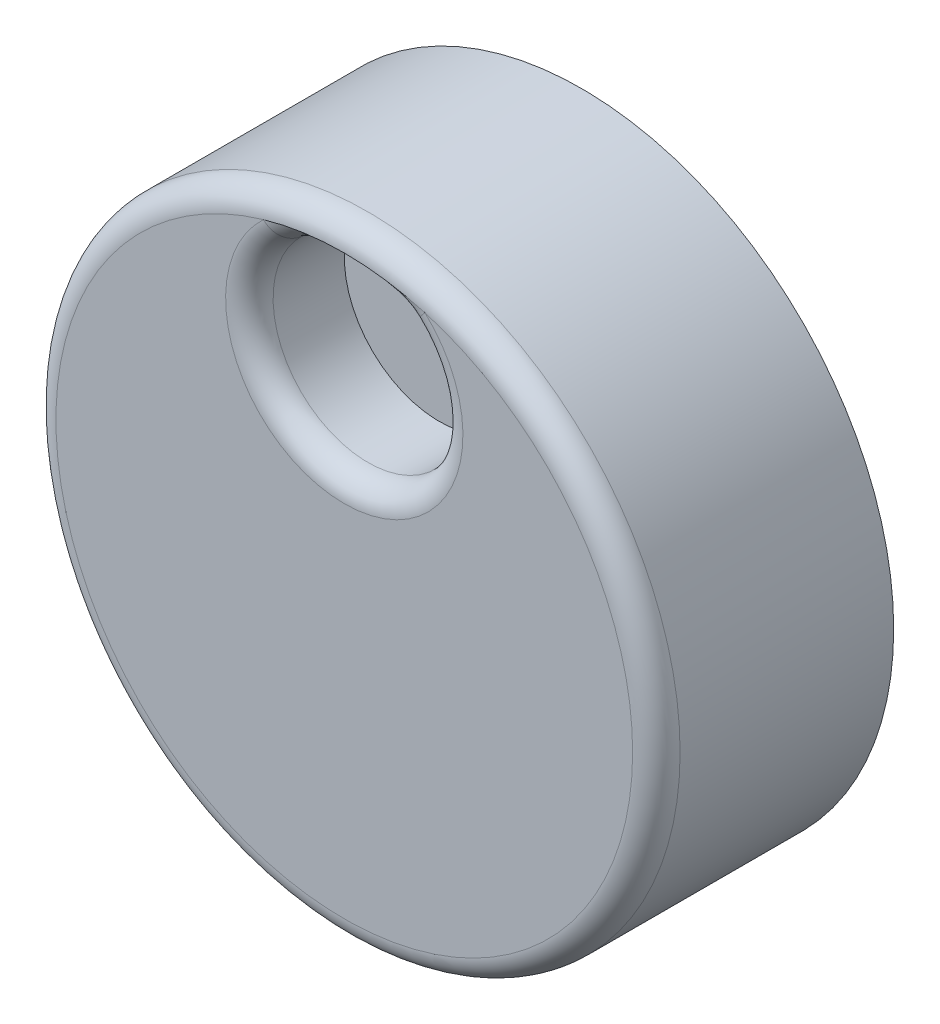
ISO-10303-21;
HEADER;
FILE_DESCRIPTION(('STEP AP214'),'2;1');
FILE_NAME('part.step','',(''),(''),'','','');
FILE_SCHEMA(('AUTOMOTIVE_DESIGN { 1 0 10303 214 1 1 1 1 }'));
ENDSEC;
DATA;
#1=APPLICATION_CONTEXT('core data for automotive mechanical design processes');
#2=APPLICATION_PROTOCOL_DEFINITION('international standard','automotive_design',2000,#1);
#3=PRODUCT_CONTEXT('',#1,'mechanical');
#4=PRODUCT('Part','Part','',(#3));
#5=PRODUCT_RELATED_PRODUCT_CATEGORY('part','',(#4));
#6=PRODUCT_DEFINITION_FORMATION('','',#4);
#7=PRODUCT_DEFINITION_CONTEXT('part definition',#1,'design');
#8=PRODUCT_DEFINITION('design','',#6,#7);
#9=PRODUCT_DEFINITION_SHAPE('','',#8);
#10=(LENGTH_UNIT() NAMED_UNIT(*) SI_UNIT(.MILLI.,.METRE.));
#11=(NAMED_UNIT(*) PLANE_ANGLE_UNIT() SI_UNIT($,.RADIAN.));
#12=(NAMED_UNIT(*) SI_UNIT($,.STERADIAN.) SOLID_ANGLE_UNIT());
#13=UNCERTAINTY_MEASURE_WITH_UNIT(LENGTH_MEASURE(1.E-05),#10,'distance_accuracy_value','');
#14=(GEOMETRIC_REPRESENTATION_CONTEXT(3) GLOBAL_UNCERTAINTY_ASSIGNED_CONTEXT((#13)) GLOBAL_UNIT_ASSIGNED_CONTEXT((#10,
#11,#12)) REPRESENTATION_CONTEXT('',''));
#15=CARTESIAN_POINT('',(0.,0.,0.));
#16=DIRECTION('',(0.,0.,1.));
#17=DIRECTION('',(1.,0.,0.));
#18=AXIS2_PLACEMENT_3D('',#15,#16,#17);
#19=CARTESIAN_POINT('',(0.,0.,10.));
#20=DIRECTION('',(0.,0.,-1.));
#21=DIRECTION('',(-1.,0.,0.));
#22=AXIS2_PLACEMENT_3D('',#19,#20,#21);
#23=CYLINDRICAL_SURFACE('',#22,13.15);
#24=CARTESIAN_POINT('',(0.,0.,9.));
#25=DIRECTION('',(0.,0.,1.));
#26=DIRECTION('',(1.,0.,0.));
#27=AXIS2_PLACEMENT_3D('',#24,#25,#26);
#28=CIRCLE('',#27,13.15);
#29=CARTESIAN_POINT('',(13.15,0.,9.));
#30=VERTEX_POINT('',#29);
#31=EDGE_CURVE('E88',#30,#30,#28,.F.);
#32=ORIENTED_EDGE('',*,*,#31,.T.);
#33=EDGE_LOOP('',(#32));
#34=FACE_BOUND('',#33,.T.);
#35=CARTESIAN_POINT('',(0.,0.,0.));
#36=DIRECTION('',(0.,0.,1.));
#37=DIRECTION('',(1.,0.,0.));
#38=AXIS2_PLACEMENT_3D('',#35,#36,#37);
#39=CIRCLE('',#38,13.15);
#40=CARTESIAN_POINT('',(13.15,0.,0.));
#41=VERTEX_POINT('',#40);
#42=EDGE_CURVE('E122',#41,#41,#39,.T.);
#43=ORIENTED_EDGE('',*,*,#42,.T.);
#44=EDGE_LOOP('',(#43));
#45=FACE_BOUND('',#44,.T.);
#46=ADVANCED_FACE('F43',(#34,#45),#23,.T.);
#47=CARTESIAN_POINT('',(0.,0.,10.));
#48=DIRECTION('',(0.,0.,1.));
#49=DIRECTION('',(1.,0.,0.));
#50=AXIS2_PLACEMENT_3D('',#47,#48,#49);
#51=PLANE('',#50);
#52=CARTESIAN_POINT('',(0.,0.,10.));
#53=DIRECTION('',(0.,0.,1.));
#54=DIRECTION('',(1.,0.,0.));
#55=AXIS2_PLACEMENT_3D('',#52,#53,#54);
#56=CIRCLE('',#55,12.15);
#57=CARTESIAN_POINT('',(-3.40232141209659,11.66390625,10.));
#58=VERTEX_POINT('',#57);
#59=CARTESIAN_POINT('',(3.40232141209659,11.66390625,10.));
#60=VERTEX_POINT('',#59);
#61=EDGE_CURVE('E127',#58,#60,#56,.T.);
#62=ORIENTED_EDGE('',*,*,#61,.T.);
#63=CARTESIAN_POINT('',(0.,8.,10.));
#64=DIRECTION('',(0.,0.,1.));
#65=DIRECTION('',(1.,0.,0.));
#66=AXIS2_PLACEMENT_3D('',#63,#64,#65);
#67=CIRCLE('',#66,5.);
#68=EDGE_CURVE('E11',#60,#58,#67,.F.);
#69=ORIENTED_EDGE('',*,*,#68,.T.);
#70=EDGE_LOOP('',(#62,#69));
#71=FACE_BOUND('',#70,.T.);
#72=ADVANCED_FACE('F115',(#71),#51,.T.);
#73=CARTESIAN_POINT('',(0.,0.,0.));
#74=DIRECTION('',(0.,0.,1.));
#75=DIRECTION('',(1.,0.,0.));
#76=AXIS2_PLACEMENT_3D('',#73,#74,#75);
#77=PLANE('',#76);
#78=CARTESIAN_POINT('',(0.,0.,0.));
#79=DIRECTION('',(0.,0.,-1.));
#80=DIRECTION('',(-1.,0.,0.));
#81=AXIS2_PLACEMENT_3D('',#78,#79,#80);
#82=CIRCLE('',#81,3.125);
#83=CARTESIAN_POINT('',(-3.125,0.,0.));
#84=VERTEX_POINT('',#83);
#85=EDGE_CURVE('E130',#84,#84,#82,.T.);
#86=ORIENTED_EDGE('',*,*,#85,.F.);
#87=EDGE_LOOP('',(#86));
#88=FACE_BOUND('',#87,.T.);
#89=ORIENTED_EDGE('',*,*,#42,.F.);
#90=EDGE_LOOP('',(#89));
#91=FACE_BOUND('',#90,.T.);
#92=ADVANCED_FACE('F140',(#88,#91),#77,.F.);
#93=CARTESIAN_POINT('',(0.,0.,9.));
#94=DIRECTION('',(0.,0.,1.));
#95=DIRECTION('',(1.,0.,0.));
#96=AXIS2_PLACEMENT_3D('',#93,#94,#95);
#97=TOROIDAL_SURFACE('',#96,12.15,1.);
#98=ORIENTED_EDGE('',*,*,#31,.F.);
#99=EDGE_LOOP('',(#98));
#100=FACE_BOUND('',#99,.T.);
#101=EDGE_CURVE('E82',#60,#58,#56,.T.);
#102=ORIENTED_EDGE('',*,*,#101,.F.);
#103=ORIENTED_EDGE('',*,*,#61,.F.);
#104=EDGE_LOOP('',(#102,#103));
#105=FACE_BOUND('',#104,.T.);
#106=ADVANCED_FACE('F106',(#100,#105),#97,.T.);
#107=CARTESIAN_POINT('',(0.,8.,6.));
#108=DIRECTION('',(0.,0.,1.));
#109=DIRECTION('',(1.,0.,0.));
#110=AXIS2_PLACEMENT_3D('',#107,#108,#109);
#111=CYLINDRICAL_SURFACE('',#110,4.);
#112=CARTESIAN_POINT('',(0.,8.,9.));
#113=DIRECTION('',(0.,0.,1.));
#114=DIRECTION('',(1.,0.,0.));
#115=AXIS2_PLACEMENT_3D('',#112,#113,#114);
#116=CIRCLE('',#115,4.);
#117=CARTESIAN_POINT('',(-2.72185712967727,10.931125,9.));
#118=VERTEX_POINT('',#117);
#119=CARTESIAN_POINT('',(2.72185712967727,10.931125,9.));
#120=VERTEX_POINT('',#119);
#121=EDGE_CURVE('E86',#118,#120,#116,.T.);
#122=ORIENTED_EDGE('',*,*,#121,.T.);
#123=CARTESIAN_POINT('',(4.15330833535075,11.4180790797536,10.));
#124=CARTESIAN_POINT('',(3.72763776066255,11.1642189126805,10.1914181977703));
#125=CARTESIAN_POINT('',(3.42224825637452,10.8375690498555,9.90450624819956));
#126=CARTESIAN_POINT('',(3.11685875208649,10.5109191870305,9.61759429862879));
#127=CARTESIAN_POINT('',(3.20066403612086,10.3991143632354,9.10499532792805));
#128=CARTESIAN_POINT('',(4.09555974182805,11.4390907582192,10.));
#129=CARTESIAN_POINT('',(3.68294707085545,11.1722052705689,10.1738068568766));
#130=CARTESIAN_POINT('',(3.38763479748877,10.8562041720172,9.88313811042775));
#131=CARTESIAN_POINT('',(3.09263331720612,10.5400121915394,9.5926535912695));
#132=CARTESIAN_POINT('',(3.16674630733149,10.4443878403858,9.08576928020311));
#133=CARTESIAN_POINT('',(4.03677559062463,11.4599718929904,10.));
#134=CARTESIAN_POINT('',(3.63675862072685,11.1830507222994,10.1562165783765));
#135=CARTESIAN_POINT('',(3.35129275605686,10.8772723075058,9.86292421447825));
#136=CARTESIAN_POINT('',(3.06613320245137,10.5713032889187,9.56978342834648));
#137=CARTESIAN_POINT('',(3.13146918846418,10.4894277666376,9.06975703229647));
#138=CARTESIAN_POINT('',(3.91771517635129,11.5012144177846,10.));
#139=CARTESIAN_POINT('',(3.54230224911096,11.2089801170612,10.1219968336009));
#140=CARTESIAN_POINT('',(3.27566060010154,10.9228548985107,9.82511715135767));
#141=CARTESIAN_POINT('',(3.00931471034941,10.6365573637621,9.52838683945949));
#142=CARTESIAN_POINT('',(3.05854702412956,10.5784810157243,9.043268773883));
#143=CARTESIAN_POINT('',(3.85744214272831,11.5215767663186,10.));
#144=CARTESIAN_POINT('',(3.49403032688505,11.2240289565234,10.1053489981445));
#145=CARTESIAN_POINT('',(3.23637654515488,10.9473623565001,9.80751880875616));
#146=CARTESIAN_POINT('',(2.97901926808651,10.6705109119552,9.50980678939183));
#147=CARTESIAN_POINT('',(3.02090687027421,10.6224962165467,9.03278172300138));
#148=CARTESIAN_POINT('',(3.73618837091529,11.5614641006066,10.));
#149=CARTESIAN_POINT('',(3.39606975585306,11.2568820807277,10.0737646411657));
#150=CARTESIAN_POINT('',(3.15552102529219,10.9983044893818,9.77528436126342));
#151=CARTESIAN_POINT('',(2.9152646666267,10.739540755735,9.47692067660312));
#152=CARTESIAN_POINT('',(2.94375164926536,10.7088121378773,9.01644213860568));
#153=CARTESIAN_POINT('',(3.67521592173952,11.5809940835346,10.));
#154=CARTESIAN_POINT('',(3.34638267309756,11.2746531282782,10.0587975224619));
#155=CARTESIAN_POINT('',(3.1139681909994,11.0247239181331,9.76062772218791));
#156=CARTESIAN_POINT('',(2.88183868443764,10.7746141628773,9.46254700494208));
#157=CARTESIAN_POINT('',(2.90425213847084,10.7511229680481,9.01055658425827));
#158=CARTESIAN_POINT('',(3.55236902775948,11.6192648762249,10.));
#159=CARTESIAN_POINT('',(3.24546849327123,11.3120620178251,10.030628327074));
#160=CARTESIAN_POINT('',(3.02858616222957,11.0787386803592,9.73403742586988));
#161=CARTESIAN_POINT('',(2.81198722098302,10.8452363246162,9.43753444811353));
#162=CARTESIAN_POINT('',(2.82331132896572,10.8341269572392,9.00260420748856));
#163=CARTESIAN_POINT('',(3.4904939855267,11.6380051280857,10.));
#164=CARTESIAN_POINT('',(3.19422419593948,11.3316985546186,10.0174084390009));
#165=CARTESIAN_POINT('',(2.98475540577288,11.1063348183164,9.72210566815499));
#166=CARTESIAN_POINT('',(2.7755612946147,10.8808006869627,9.4268668997257));
#167=CARTESIAN_POINT('',(2.78186869980844,10.8748189715558,9.00054004189399));
#168=CARTESIAN_POINT('',(3.33121735656144,11.6848499041843,10.));
#169=CARTESIAN_POINT('',(3.06153488861087,11.3832611459852,9.98598150696315));
#170=CARTESIAN_POINT('',(2.86995618167547,11.1775299819973,9.69487076231434));
#171=CARTESIAN_POINT('',(2.67903916983154,10.9713885266703,9.4039187969668));
#172=CARTESIAN_POINT('',(2.67352963115148,10.9766493927253,8.99939468952385));
#173=CARTESIAN_POINT('',(3.23332607697612,11.712321079107,10.));
#174=CARTESIAN_POINT('',(2.97884276986842,11.416058388639,9.96899131377636));
#175=CARTESIAN_POINT('',(2.7975366742342,11.2214359645996,9.68142177761794));
#176=CARTESIAN_POINT('',(2.61684781414028,11.0264540788388,9.39394327242348));
#177=CARTESIAN_POINT('',(2.60537618560475,11.0364759015107,9.00263147488296));
#178=CARTESIAN_POINT('',(3.03641944287902,11.7649081255496,10.));
#179=CARTESIAN_POINT('',(2.81071480170222,11.4821315676039,9.93931490044425));
#180=CARTESIAN_POINT('',(2.64852244714831,11.308320856117,9.66002501495147));
#181=CARTESIAN_POINT('',(2.48694509841976,11.134151133663,9.3808210535605));
#182=CARTESIAN_POINT('',(2.46540238982909,11.1511896233905,9.01518637199615));
#183=CARTESIAN_POINT('',(2.93740377227428,11.7900233153999,10.));
#184=CARTESIAN_POINT('',(2.72521062932748,11.5154391028625,9.9265786986378));
#185=CARTESIAN_POINT('',(2.57192652919528,11.3512994939661,9.65207882491548));
#186=CARTESIAN_POINT('',(2.41920787702629,11.1868595980264,9.37761324808793));
#187=CARTESIAN_POINT('',(2.39358098755736,11.2060754067745,9.02450623763069));
#188=CARTESIAN_POINT('',(2.63824497803695,11.8618838579157,10.));
#189=CARTESIAN_POINT('',(2.46526268756636,11.6137420914495,9.89418334376081));
#190=CARTESIAN_POINT('',(2.33603030393895,11.4771664601576,9.63513287256471));
#191=CARTESIAN_POINT('',(2.20904187983528,11.3393907037573,9.37625615697228));
#192=CARTESIAN_POINT('',(2.17267529607281,11.3633627373659,9.05950335442168));
#193=CARTESIAN_POINT('',(2.43672202176824,11.9049283867028,10.));
#194=CARTESIAN_POINT('',(2.28572346111084,11.6777969609867,9.88002093306708));
#195=CARTESIAN_POINT('',(2.17115419909485,11.5566382560622,9.63313740537818));
#196=CARTESIAN_POINT('',(2.05839001346352,11.4347267970235,9.38621901592364));
#197=CARTESIAN_POINT('',(2.01865113796147,11.4579245149756,9.09220049345254));
#198=CARTESIAN_POINT('',(2.02251918094506,11.982416714106,10.));
#199=CARTESIAN_POINT('',(1.91123172170543,11.7968965185356,9.86255787860872));
#200=CARTESIAN_POINT('',(1.82278554432249,11.7031714855675,9.6412975099736));
#201=CARTESIAN_POINT('',(1.736287491882,11.6086203010349,9.41998385167425));
#202=CARTESIAN_POINT('',(1.69371984006115,11.6285674318232,9.16861272454309));
#203=CARTESIAN_POINT('',(1.80973316687223,12.0164091038328,10.));
#204=CARTESIAN_POINT('',(1.7152792531206,11.8518066967573,9.85958729123604));
#205=CARTESIAN_POINT('',(1.63879663082088,11.769549219839,9.65198125638214));
#206=CARTESIAN_POINT('',(1.5637314549189,11.6868634644088,9.44428093573634));
#207=CARTESIAN_POINT('',(1.52237093933554,11.7036747580541,9.21274245610353));
#208=CARTESIAN_POINT('',(1.4884677357265,12.0589638991937,10.));
#209=CARTESIAN_POINT('',(1.4156670182159,11.9218583414869,9.86023542553465));
#210=CARTESIAN_POINT('',(1.3556165549775,11.8538023017546,9.6721335738965));
#211=CARTESIAN_POINT('',(1.29591810791628,11.7856447863087,9.48400339720087));
#212=CARTESIAN_POINT('',(1.25892306890879,11.7978671703341,9.2788738434496));
#213=CARTESIAN_POINT('',(1.38103831822383,12.0717426630732,10.));
#214=CARTESIAN_POINT('',(1.31502679989862,11.9431423830585,9.86129155447894));
#215=CARTESIAN_POINT('',(1.26002995817669,11.8793332894086,9.67953820302346));
#216=CARTESIAN_POINT('',(1.20531716800337,11.8154570251107,9.49776173159225));
#217=CARTESIAN_POINT('',(1.17004212741147,11.8261853493842,9.30090572616643));
#218=CARTESIAN_POINT('',(1.16532151859211,12.0944744919206,10.));
#219=CARTESIAN_POINT('',(1.11203102522859,11.9812902839816,9.86439108114283));
#220=CARTESIAN_POINT('',(1.06665658070485,11.9250110296739,9.69467333605554));
#221=CARTESIAN_POINT('',(1.02156659353458,11.868664655329,9.52493421175374));
#222=CARTESIAN_POINT('',(0.990307051406058,11.8765993046376,9.34334895028892));
#223=CARTESIAN_POINT('',(1.05703412146462,12.1044275073788,10.));
#224=CARTESIAN_POINT('',(1.00960283352625,11.9981816153261,9.86643278688582));
#225=CARTESIAN_POINT('',(0.968869761516253,11.9451576879464,9.70240384566767));
#226=CARTESIAN_POINT('',(0.928354112655206,11.8920990974915,9.53835975262656));
#227=CARTESIAN_POINT('',(0.899452882355177,11.8986949718165,9.36376026329617));
#228=CARTESIAN_POINT('',(0.746777598186706,12.128706237492,10.));
#229=CARTESIAN_POINT('',(0.715423387819758,12.039518838517,9.87254830845711));
#230=CARTESIAN_POINT('',(0.687146082683373,11.9944765763669,9.72315946195339));
#231=CARTESIAN_POINT('',(0.659597684360936,11.9493004434,9.5737153165144));
#232=CARTESIAN_POINT('',(0.637780795561235,11.9526219246802,9.41681331009379));
#233=CARTESIAN_POINT('',(0.543370201691124,12.1395641401813,10.));
#234=CARTESIAN_POINT('',(0.520848629561865,12.0583626703459,9.87689118249065));
#235=CARTESIAN_POINT('',(0.500591522282194,12.0167775429719,9.73510371478701));
#236=CARTESIAN_POINT('',(0.480600608420021,11.9751696981066,9.59330669387358));
#237=CARTESIAN_POINT('',(0.464597561784191,11.9767786652202,9.44511527261971));
#238=CARTESIAN_POINT('',(0.236957794965427,12.1481186696398,10.));
#239=CARTESIAN_POINT('',(0.227276853524922,12.073195970524,9.88048613174798));
#240=CARTESIAN_POINT('',(0.218536646319516,12.034359949719,9.74482758170695));
#241=CARTESIAN_POINT('',(0.20986530161471,11.9955226878233,9.60916684507399));
#242=CARTESIAN_POINT('',(0.202811386312069,11.9958131289741,9.46798304312254));
#243=CARTESIAN_POINT('',(0.134722474874996,12.1496841000286,10.));
#244=CARTESIAN_POINT('',(0.129207905164936,12.0759142443947,9.88120053234104));
#245=CARTESIAN_POINT('',(0.124258207345541,12.0375813222467,9.74670599616263));
#246=CARTESIAN_POINT('',(0.119315267894152,11.9992491567235,9.6122115228446));
#247=CARTESIAN_POINT('',(0.115316495548935,11.9992970495361,9.47234766568704));
#248=CARTESIAN_POINT('',(-0.0698277439963968,12.1502292470355,10.));
#249=CARTESIAN_POINT('',(-0.0669641679475987,12.0768584913566,9.88144207294846));
#250=CARTESIAN_POINT('',(-0.0644035655850577,12.0387019556302,9.74734841136457));
#251=CARTESIAN_POINT('',(-0.0618368228265257,12.0005445867432,9.61325464300735));
#252=CARTESIAN_POINT('',(-0.0597690592943022,12.0005101033301,9.47384763292325));
#253=CARTESIAN_POINT('',(-0.172142639927268,12.1492090523496,10.));
#254=CARTESIAN_POINT('',(-0.165130824820578,12.0750852315341,9.88096941309939));
#255=CARTESIAN_POINT('',(-0.158786895832529,12.0366013990466,9.74611251894244));
#256=CARTESIAN_POINT('',(-0.152497545487189,11.9981145996714,9.61125394138614));
#257=CARTESIAN_POINT('',(-0.147359719986136,11.9982394339648,9.47098322557595));
#258=CARTESIAN_POINT('',(-0.37595861720737,12.1446087837909,10.));
#259=CARTESIAN_POINT('',(-0.360428678957753,12.0671118913068,9.87899922155546));
#260=CARTESIAN_POINT('',(-0.346531155340635,12.0271449391545,9.74081588924649));
#261=CARTESIAN_POINT('',(-0.332687415675044,11.9871754952432,9.60263118285602));
#262=CARTESIAN_POINT('',(-0.32160591575245,11.9880031909241,9.45856072822536));
#263=CARTESIAN_POINT('',(-0.477461237277275,12.1410366431067,10.));
#264=CARTESIAN_POINT('',(-0.457624533940897,12.0609204194234,9.87750364337786));
#265=CARTESIAN_POINT('',(-0.43989434493278,12.0198053224766,9.73676390735737));
#266=CARTESIAN_POINT('',(-0.422276662607184,11.9786782028037,9.59601801775486));
#267=CARTESIAN_POINT('',(-0.408263506097927,11.980055266041,9.44902338415118));
#268=CARTESIAN_POINT('',(-0.679697931394177,12.1313959227216,10.));
#269=CARTESIAN_POINT('',(-0.650824252651346,12.0442957210638,9.87397178468277));
#270=CARTESIAN_POINT('',(-0.625350244328963,12.0000590769466,9.72668174187421));
#271=CARTESIAN_POINT('',(-0.599989170528004,11.9558104519794,9.57938559677011));
#272=CARTESIAN_POINT('',(-0.580427786661493,11.9586152480206,9.42478111513024));
#273=CARTESIAN_POINT('',(-0.780431736067347,12.125326505565,10.));
#274=CARTESIAN_POINT('',(-0.746887623495252,12.0338506237216,9.87193354230773));
#275=CARTESIAN_POINT('',(-0.717442517216359,11.9876507483241,9.72065089481));
#276=CARTESIAN_POINT('',(-0.688166594232879,11.9414236050382,9.56935576604321));
#277=CARTESIAN_POINT('',(-0.665934080851751,11.9451212950377,9.41007445690765));
#278=CARTESIAN_POINT('',(-0.981452426330389,12.1107161654073,10.));
#279=CARTESIAN_POINT('',(-0.937938927610036,12.0088801903798,9.86790881769579));
#280=CARTESIAN_POINT('',(-0.900369722197967,11.9579136387431,9.70759797336888));
#281=CARTESIAN_POINT('',(-0.862971220060266,11.9069191007945,9.54727535982534));
#282=CARTESIAN_POINT('',(-0.835821733983299,11.9126601719159,9.37719175014115));
#283=CARTESIAN_POINT('',(-1.08173591083948,12.1021654502764,10.));
#284=CARTESIAN_POINT('',(-1.03297881180094,11.994323217836,9.86592141238133));
#285=CARTESIAN_POINT('',(-0.991198148804839,11.9405653681073,9.70057202932425));
#286=CARTESIAN_POINT('',(-0.949642622018269,11.8867571820935,9.53520615302684));
#287=CARTESIAN_POINT('',(-0.920197222680852,11.8936713176878,9.35900205489224));
#288=CARTESIAN_POINT('',(-1.28148085681784,12.0826481009671,10.));
#289=CARTESIAN_POINT('',(-1.22144336606124,11.9614106603623,9.86260388115434));
#290=CARTESIAN_POINT('',(-1.1709783292179,11.9012128665329,9.68651681261412));
#291=CARTESIAN_POINT('',(-1.12073994388522,11.8409665187416,9.51041091379817));
#292=CARTESIAN_POINT('',(-1.08726141360351,11.8503657317499,9.32079649037561));
#293=CARTESIAN_POINT('',(-1.38094234859781,12.0716815562878,10.));
#294=CARTESIAN_POINT('',(-1.31492531074201,11.9430349429712,9.86127430815106));
#295=CARTESIAN_POINT('',(-1.25993015241272,11.879208808078,9.67948754008155));
#296=CARTESIAN_POINT('',(-1.20521592633857,11.8153093126262,9.49767518795306));
#297=CARTESIAN_POINT('',(-1.16995017819258,11.8260491974144,9.3007806887756));
#298=CARTESIAN_POINT('',(-1.70923206704563,12.031387239508,10.));
#299=CARTESIAN_POINT('',(-1.62243274364111,11.8761158731791,9.85891105452092));
#300=CARTESIAN_POINT('',(-1.55119252872845,11.7989500943254,9.65765363442772));
#301=CARTESIAN_POINT('',(-1.4814506390405,11.7213620354058,9.45629440311797));
#302=CARTESIAN_POINT('',(-1.44082132729463,11.7367929436747,9.23373683030358));
#303=CARTESIAN_POINT('',(-1.93682175166786,11.9968277725055,10.));
#304=CARTESIAN_POINT('',(-1.83294914401225,11.8196834814233,9.86059189152718));
#305=CARTESIAN_POINT('',(-1.74933172474054,11.7309720890454,9.64472808666022));
#306=CARTESIAN_POINT('',(-1.66785435557021,11.6413793824562,9.42880761744408));
#307=CARTESIAN_POINT('',(-1.62527859945721,11.6603705204024,9.18567631239481));
#308=CARTESIAN_POINT('',(-2.27553618678024,11.9355603652723,10.));
#309=CARTESIAN_POINT('',(-2.13954212154813,11.724917206258,9.87270440945455));
#310=CARTESIAN_POINT('',(-2.03599253189325,11.6144037166021,9.63579786731406));
#311=CARTESIAN_POINT('',(-1.93298490945667,11.503675426229,9.39886939793177));
#312=CARTESIAN_POINT('',(-1.89256164180704,11.5253621314983,9.12155713507046));
#313=CARTESIAN_POINT('',(-2.38798821282956,11.9135683958493,10.));
#314=CARTESIAN_POINT('',(-2.24076720166014,11.6914352876043,9.87838899817598));
#315=CARTESIAN_POINT('',(-2.12978194654794,11.5731174292072,9.63456386531438));
#316=CARTESIAN_POINT('',(-2.01941412651827,11.4545104340748,9.39074520885192));
#317=CARTESIAN_POINT('',(-1.98008305331179,11.4769676392503,9.10151379885462));
#318=CARTESIAN_POINT('',(-2.61200603919596,11.8664664543617,10.));
#319=CARTESIAN_POINT('',(-2.44034811392248,11.6219741932335,9.89371230978105));
#320=CARTESIAN_POINT('',(-2.31342398446142,11.4865466196339,9.63667762671307));
#321=CARTESIAN_POINT('',(-2.18712109368884,11.3508242464321,9.37965072869775));
#322=CARTESIAN_POINT('',(-2.15162849142516,11.3735038561697,9.0655329576711));
#323=CARTESIAN_POINT('',(-2.72357214594165,11.8413576152632,10.));
#324=CARTESIAN_POINT('',(-2.53879639125509,11.5859403816062,9.90338495214724));
#325=CARTESIAN_POINT('',(-2.4032780222359,11.441263551984,9.64002372967571));
#326=CARTESIAN_POINT('',(-2.26845891697664,11.2962110311844,9.37670738900951));
#327=CARTESIAN_POINT('',(-2.23565377411598,11.3184369908831,9.04959396723428));
#328=CARTESIAN_POINT('',(-2.98826512484477,11.7778462830621,10.));
#329=CARTESIAN_POINT('',(-2.77001939666946,11.4984858060168,9.93211174914367));
#330=CARTESIAN_POINT('',(-2.61208012289665,11.3299038534849,9.65488254264765));
#331=CARTESIAN_POINT('',(-2.4554822391629,11.1606103481515,9.37775560346197));
#332=CARTESIAN_POINT('',(-2.43117730429263,11.1794200735662,9.01845826777471));
#333=CARTESIAN_POINT('',(-3.1409582835768,11.7380336131283,10.));
#334=CARTESIAN_POINT('',(-2.9012388425958,11.4465125316915,9.95340095971393));
#335=CARTESIAN_POINT('',(-2.72900330223042,11.2625013753159,9.66903043347451));
#336=CARTESIAN_POINT('',(-2.55828813397741,11.0775720154722,9.38495732381403));
#337=CARTESIAN_POINT('',(-2.54088390711084,11.0924812153376,9.00587978487645));
#338=CARTESIAN_POINT('',(-3.36716839030246,11.6743654727313,10.));
#339=CARTESIAN_POINT('',(-3.09143345028945,11.3716790307882,9.99288778795748));
#340=CARTESIAN_POINT('',(-2.89597789304642,11.161524764902,9.70083113060354));
#341=CARTESIAN_POINT('',(-2.70090626690332,10.9511377003749,9.4088436375667));
#342=CARTESIAN_POINT('',(-2.6980795309044,10.9538524124343,8.9994652285446));
#343=CARTESIAN_POINT('',(-3.44197462869573,11.6525252734613,10.));
#344=CARTESIAN_POINT('',(-3.15399679487963,11.347150157181,10.0073849899184));
#345=CARTESIAN_POINT('',(-2.95014889663472,11.1279443980837,9.71316443065352));
#346=CARTESIAN_POINT('',(-2.74670229329873,10.9084860670079,9.41905131683106));
#347=CARTESIAN_POINT('',(-2.74916957570569,10.9063609235609,8.9993921200829));
#348=CARTESIAN_POINT('',(-3.59048031956234,11.6076247136137,10.));
#349=CARTESIAN_POINT('',(-3.27701721520992,11.3001515727185,10.0389586753927));
#350=CARTESIAN_POINT('',(-3.05542052996276,11.0618715796961,9.74167524021435));
#351=CARTESIAN_POINT('',(-2.83422573382539,10.8233400521389,9.4445018952605));
#352=CARTESIAN_POINT('',(-2.84870783802081,10.8088615985531,9.00429048729389));
#353=CARTESIAN_POINT('',(-3.66418049159133,11.5845651947497,10.));
#354=CARTESIAN_POINT('',(-3.33750499016733,11.2776789121619,10.056064870044));
#355=CARTESIAN_POINT('',(-3.10652322707518,11.0293784022836,9.75785012407532));
#356=CARTESIAN_POINT('',(-2.87595700412751,10.7808153218206,9.4597894300226));
#357=CARTESIAN_POINT('',(-2.89715783227353,10.7588554994285,9.00925852499491));
#358=CARTESIAN_POINT('',(-3.78467917972374,11.5456141482613,10.));
#359=CARTESIAN_POINT('',(-3.43525455694188,11.243548695096,10.0861930364963));
#360=CARTESIAN_POINT('',(-3.18802426534437,10.9777985329216,9.78788405738827));
#361=CARTESIAN_POINT('',(-2.94097241611981,10.7119351674765,9.489640231075));
#362=CARTESIAN_POINT('',(-2.97474002531754,10.6745039196585,9.02254859419295));
#363=CARTESIAN_POINT('',(-3.83191613713276,11.530020013005,10.));
#364=CARTESIAN_POINT('',(-3.47337787011722,11.2308208099034,10.0986060954259));
#365=CARTESIAN_POINT('',(-3.21944023078143,10.9579806636774,9.8005909258643));
#366=CARTESIAN_POINT('',(-2.96568256964428,10.6850287250699,9.50265522822854));
#367=CARTESIAN_POINT('',(-3.00472853962632,10.6407628730279,9.02910235935778));
#368=CARTESIAN_POINT('',(-3.92556105463751,11.4984742412934,10.));
#369=CARTESIAN_POINT('',(-3.54842768268659,11.2074361752432,10.1242195882163));
#370=CARTESIAN_POINT('',(-3.28058996911685,10.9199749904259,9.82766662342027));
#371=CARTESIAN_POINT('',(-3.01293311017233,10.6324013334749,9.53119395634039));
#372=CARTESIAN_POINT('',(-3.06331871339951,10.5725664409347,9.04520312486406));
#373=CARTESIAN_POINT('',(-3.97196946911959,11.4825228123278,10.));
#374=CARTESIAN_POINT('',(-3.58536070846519,11.1967865002791,10.1374286630258));
#375=CARTESIAN_POINT('',(-3.31032468472271,10.9017862695149,9.84203450709721));
#376=CARTESIAN_POINT('',(-3.03547001028357,10.6066776647978,9.54673606495083));
#377=CARTESIAN_POINT('',(-3.09192114875148,10.5381114708945,9.0547484277489));
#378=CARTESIAN_POINT('',(-4.06407874645186,11.4502469528171,10.));
#379=CARTESIAN_POINT('',(-3.65811228858514,11.1781386195038,10.1644181621492));
#380=CARTESIAN_POINT('',(-3.36812146895503,10.8675600675262,9.87241807667654));
#381=CARTESIAN_POINT('',(-3.07831429015825,10.5568737619603,9.58051414647076));
#382=CARTESIAN_POINT('',(-3.14781445865112,10.4684541747308,9.07734088089295));
#383=CARTESIAN_POINT('',(-4.10977262422756,11.433920720224,10.));
#384=CARTESIAN_POINT('',(-3.69392380778059,11.1701736521092,10.1782090618546));
#385=CARTESIAN_POINT('',(-3.39617074553717,10.8515381057051,9.88844433339439));
#386=CARTESIAN_POINT('',(-3.09859662333587,10.5328100432867,9.59878952258231));
#387=CARTESIAN_POINT('',(-3.17509505670969,10.4332483540142,9.09041147230547));
#388=CARTESIAN_POINT('',(-4.19986164932712,11.4011395667667,10.));
#389=CARTESIAN_POINT('',(-3.76393291886479,11.1578068299225,10.2056394461162));
#390=CARTESIAN_POINT('',(-3.45013379445641,10.8226303565598,9.92168169863795));
#391=CARTESIAN_POINT('',(-3.13651962387389,10.4873514349127,9.63783816851035));
#392=CARTESIAN_POINT('',(-3.22800550835423,10.3626147817333,9.12058799340259));
#393=CARTESIAN_POINT('',(-4.24425456201846,11.384684479711,10.));
#394=CARTESIAN_POINT('',(-3.79812764241995,11.1534331493481,10.2192818661177));
#395=CARTESIAN_POINT('',(-3.47604401709269,10.8097497156147,9.93889469299521));
#396=CARTESIAN_POINT('',(-3.15414381987601,10.465972088331,9.6586385194147));
#397=CARTESIAN_POINT('',(-3.25363260319394,10.3271867622345,9.13770045574984));
#398=CARTESIAN_POINT('',(-4.28778972754864,11.3682610478616,10.));
#399=CARTESIAN_POINT('',(-3.83120958091071,11.1512944766922,10.232444191802));
#400=CARTESIAN_POINT('',(-3.50071794937604,10.7988867018055,9.95648356545034));
#401=CARTESIAN_POINT('',(-3.17022631784136,10.4464789269188,9.68052293909873));
#402=CARTESIAN_POINT('',(-3.27832379721143,10.2918536342091,9.15709559990094));
#403=(BOUNDED_SURFACE() B_SPLINE_SURFACE(3,2,((#123,#124,#125,#126,#127),(#128,#129,#130,#131,
#132),(#133,#134,#135,#136,#137),(#138,#139,#140,#141,#142),(#143,#144,#145,#146,#147),(#148,
#149,#150,#151,#152),(#153,#154,#155,#156,#157),(#158,#159,#160,#161,#162),(#163,#164,#165,#166,
#167),(#168,#169,#170,#171,#172),(#173,#174,#175,#176,#177),(#178,#179,#180,#181,#182),(#183,
#184,#185,#186,#187),(#188,#189,#190,#191,#192),(#193,#194,#195,#196,#197),(#198,#199,#200,#201,
#202),(#203,#204,#205,#206,#207),(#208,#209,#210,#211,#212),(#213,#214,#215,#216,#217),(#218,
#219,#220,#221,#222),(#223,#224,#225,#226,#227),(#228,#229,#230,#231,#232),(#233,#234,#235,#236,
#237),(#238,#239,#240,#241,#242),(#243,#244,#245,#246,#247),(#248,#249,#250,#251,#252),(#253,
#254,#255,#256,#257),(#258,#259,#260,#261,#262),(#263,#264,#265,#266,#267),(#268,#269,#270,#271,
#272),(#273,#274,#275,#276,#277),(#278,#279,#280,#281,#282),(#283,#284,#285,#286,#287),(#288,
#289,#290,#291,#292),(#293,#294,#295,#296,#297),(#298,#299,#300,#301,#302),(#303,#304,#305,#306,
#307),(#308,#309,#310,#311,#312),(#313,#314,#315,#316,#317),(#318,#319,#320,#321,#322),(#323,
#324,#325,#326,#327),(#328,#329,#330,#331,#332),(#333,#334,#335,#336,#337),(#338,#339,#340,#341,
#342),(#343,#344,#345,#346,#347),(#348,#349,#350,#351,#352),(#353,#354,#355,#356,#357),(#358,
#359,#360,#361,#362),(#363,#364,#365,#366,#367),(#368,#369,#370,#371,#372),(#373,#374,#375,#376,
#377),(#378,#379,#380,#381,#382),(#383,#384,#385,#386,#387),(#388,#389,#390,#391,#392),(#393,
#394,#395,#396,#397),(#398,#399,#400,#401,#402)),.UNSPECIFIED.,.F.,.F.,
.F.) B_SPLINE_SURFACE_WITH_KNOTS((4,2,2,2,2,2,2,2,2,2,2,2,2,2,2,2,2,2,2,2,2,2,2,2,2,2,2,4),(3,2,
3),(0.,0.219623172827436,0.438805817032306,0.656400765574608,0.87414694068258,1.21383844460028,
1.55362793203925,2.23575395008994,2.94732155980264,3.30306080146547,3.65880627563044,
4.31675253157643,4.64496705412857,4.97317031792834,5.30035771716713,5.62765492746114,
5.95626176116541,6.28485642304569,7.04396792586747,7.42347060432617,7.80283573726085,
8.32737633796754,8.58875417402576,8.84995387479158,9.0202780432758,9.19050574096178,
9.36189451923782,9.53356222289614),(0.,0.5,1.),
.UNSPECIFIED.) GEOMETRIC_REPRESENTATION_ITEM() RATIONAL_B_SPLINE_SURFACE(((1.,0.883096853335193,
1.,0.883096853335193,1.),(1.,0.886910545792198,1.,0.886910545792198,1.),(1.,0.890598325096787,
1.,0.890598325096787,1.),(1.,0.897715682246665,1.,0.897715682246665,1.),(1.,0.901145763165023,
1.,0.901145763165023,1.),(1.,0.907732696869126,1.,0.907732696869126,1.),(1.,0.910891348859457,
1.,0.910891348859457,1.),(1.,0.91697510102336,1.,0.91697510102336,1.),(1.,0.919900037354816,1.,
0.919900037354816,1.),(1.,0.92710198237778,1.,0.92710198237778,1.),(1.,0.931218825547498,1.,
0.931218825547498,1.),(1.,0.938951251534614,1.,0.938951251534614,1.),(1.,0.942566689421658,1.,
0.942566689421658,1.),(1.,0.952753011080148,1.,0.952753011080148,1.),(1.,0.958631651314857,1.,
0.958631651314857,1.),(1.,0.969012754798985,1.,0.969012754798985,1.),(1.,0.973444868751569,1.,
0.973444868751569,1.),(1.,0.978924598710925,1.,0.978924598710925,1.),(1.,0.980556369576249,1.,
0.980556369576249,1.),(1.,0.983443407393447,1.,0.983443407393447,1.),(1.,0.984698667748523,1.,
0.984698667748523,1.),(1.,0.987750110744253,1.,0.987750110744253,1.),(1.,0.989099970282834,1.,
0.989099970282834,1.),(1.,0.990162715098737,1.,0.990162715098737,1.),(1.,0.990356951867948,1.,
0.990356951867948,1.),(1.,0.990424664503596,1.,0.990424664503596,1.),(1.,0.990298151372875,1.,
0.990298151372875,1.),(1.,0.989726738247106,1.,0.989726738247106,1.),(1.,0.989282824944659,1.,
0.989282824944659,1.),(1.,0.988080979438481,1.,0.988080979438481,1.),(1.,0.987322941893326,1.,
0.987322941893326,1.),(1.,0.985490169602085,1.,0.985490169602085,1.),(1.,0.984414179783354,1.,
0.984414179783354,1.),(1.,0.981943461029702,1.,0.981943461029702,1.),(1.,0.980548743902575,1.,
0.980548743902575,1.),(1.,0.975388602654795,1.,0.975388602654795,1.),(1.,0.97091125236998,1.,
0.97091125236998,1.),(1.,0.962744759187976,1.,0.962744759187976,1.),(1.,0.959781108114893,1.,
0.959781108114893,1.),(1.,0.953329167822923,1.,0.953329167822923,1.),(1.,0.949841069141219,1.,
0.949841069141219,1.),(1.,0.940843704583776,1.,0.940843704583776,1.),(1.,0.935071789540142,1.,
0.935071789540142,1.),(1.,0.925494071401799,1.,0.925494071401799,1.),(1.,0.922154683074859,1.,
0.922154683074859,1.),(1.,0.915145744606001,1.,0.915145744606001,1.),(1.,0.911476421028377,1.,
0.911476421028377,1.),(1.,0.905127203273219,1.,0.905127203273219,1.),(1.,0.902547225905062,1.,
0.902547225905062,1.),(1.,0.897237173832027,1.,0.897237173832027,1.),(1.,0.894507184969232,1.,
0.894507184969232,1.),(1.,0.888876205088046,1.,0.888876205088046,1.),(1.,0.885974174712949,1.,
0.885974174712949,1.),(1.,0.88002017218761,1.,0.88002017218761,1.),(1.,0.876967963701978,1.,
0.876967963701978,1.),(1.,0.873847410876397,1.,0.873847410876397,1.))) REPRESENTATION_ITEM('') SURFACE());
#404=CARTESIAN_POINT('',(3.20066403612086,10.3991143632354,9.10499532792805));
#405=CARTESIAN_POINT('',(3.16674630733149,10.4443878403858,9.08576928020311));
#406=CARTESIAN_POINT('',(3.13146918846418,10.4894277666376,9.06975703229646));
#407=CARTESIAN_POINT('',(3.05854702412956,10.5784810157243,9.043268773883));
#408=CARTESIAN_POINT('',(3.02090687027421,10.6224962165467,9.03278172300138));
#409=CARTESIAN_POINT('',(2.94375164926536,10.7088121378773,9.01644213860568));
#410=CARTESIAN_POINT('',(2.90425213847084,10.7511229680481,9.01055658425827));
#411=CARTESIAN_POINT('',(2.82331132896572,10.8341269572392,9.00260420748856));
#412=CARTESIAN_POINT('',(2.78186869980844,10.8748189715558,9.00054004189399));
#413=CARTESIAN_POINT('',(2.67352963115148,10.9766493927253,8.99939468952385));
#414=CARTESIAN_POINT('',(2.60537618560475,11.0364759015107,9.00263147488296));
#415=CARTESIAN_POINT('',(2.46540238982909,11.1511896233905,9.01518637199615));
#416=CARTESIAN_POINT('',(2.39358098755736,11.2060754067745,9.02450623763069));
#417=CARTESIAN_POINT('',(2.17267529607281,11.3633627373659,9.05950335442168));
#418=CARTESIAN_POINT('',(2.01865113796147,11.4579245149756,9.09220049345254));
#419=CARTESIAN_POINT('',(1.69371984006115,11.6285674318232,9.16861272454309));
#420=CARTESIAN_POINT('',(1.52237093933554,11.7036747580541,9.21274245610353));
#421=CARTESIAN_POINT('',(1.25892306890879,11.7978671703341,9.2788738434496));
#422=CARTESIAN_POINT('',(1.17004212741147,11.8261853493842,9.30090572616643));
#423=CARTESIAN_POINT('',(0.990307051406058,11.8765993046376,9.34334895028892));
#424=CARTESIAN_POINT('',(0.899452882355177,11.8986949718165,9.36376026329617));
#425=CARTESIAN_POINT('',(0.637780795561235,11.9526219246802,9.41681331009379));
#426=CARTESIAN_POINT('',(0.464597561784191,11.9767786652202,9.44511527261971));
#427=CARTESIAN_POINT('',(0.202811386312069,11.9958131289741,9.46798304312254));
#428=CARTESIAN_POINT('',(0.115316495548935,11.9992970495361,9.47234766568704));
#429=CARTESIAN_POINT('',(-0.0597690592943023,12.0005101033301,9.47384763292325));
#430=CARTESIAN_POINT('',(-0.147359719986136,11.9982394339648,9.47098322557595));
#431=CARTESIAN_POINT('',(-0.32160591575245,11.9880031909241,9.45856072822536));
#432=CARTESIAN_POINT('',(-0.408263506097927,11.980055266041,9.44902338415118));
#433=CARTESIAN_POINT('',(-0.580427786661494,11.9586152480206,9.42478111513024));
#434=CARTESIAN_POINT('',(-0.665934080851751,11.9451212950377,9.41007445690765));
#435=CARTESIAN_POINT('',(-0.835821733983298,11.9126601719159,9.37719175014115));
#436=CARTESIAN_POINT('',(-0.920197222680852,11.8936713176878,9.35900205489224));
#437=CARTESIAN_POINT('',(-1.08726141360351,11.8503657317499,9.32079649037561));
#438=CARTESIAN_POINT('',(-1.16995017819258,11.8260491974144,9.3007806887756));
#439=CARTESIAN_POINT('',(-1.44082132729463,11.7367929436747,9.23373683030358));
#440=CARTESIAN_POINT('',(-1.62527859945721,11.6603705204024,9.18567631239481));
#441=CARTESIAN_POINT('',(-1.89256164180704,11.5253621314983,9.12155713507046));
#442=CARTESIAN_POINT('',(-1.98008305331179,11.4769676392503,9.10151379885462));
#443=CARTESIAN_POINT('',(-2.15162849142516,11.3735038561697,9.0655329576711));
#444=CARTESIAN_POINT('',(-2.23565377411598,11.3184369908831,9.04959396723428));
#445=CARTESIAN_POINT('',(-2.43117730429263,11.1794200735662,9.01845826777471));
#446=CARTESIAN_POINT('',(-2.54088390711084,11.0924812153376,9.00587978487645));
#447=CARTESIAN_POINT('',(-2.6980795309044,10.9538524124343,8.9994652285446));
#448=CARTESIAN_POINT('',(-2.74916957570569,10.9063609235609,8.9993921200829));
#449=CARTESIAN_POINT('',(-2.84870783802081,10.8088615985531,9.00429048729389));
#450=CARTESIAN_POINT('',(-2.89715783227353,10.7588554994285,9.00925852499491));
#451=CARTESIAN_POINT('',(-2.97474002531754,10.6745039196585,9.02254859419295));
#452=CARTESIAN_POINT('',(-3.00472853962632,10.6407628730279,9.02910235935778));
#453=CARTESIAN_POINT('',(-3.06331871339951,10.5725664409347,9.04520312486406));
#454=CARTESIAN_POINT('',(-3.09192114875148,10.5381114708945,9.0547484277489));
#455=CARTESIAN_POINT('',(-3.14781445865112,10.4684541747308,9.07734088089295));
#456=CARTESIAN_POINT('',(-3.17509505670969,10.4332483540142,9.09041147230547));
#457=CARTESIAN_POINT('',(-3.22800550835423,10.3626147817333,9.12058799340259));
#458=CARTESIAN_POINT('',(-3.25363260319394,10.3271867622345,9.13770045574984));
#459=CARTESIAN_POINT('',(-3.27832379721143,10.2918536342091,9.15709559990094));
#460=B_SPLINE_CURVE_WITH_KNOTS('',3,(#404,#405,#406,#407,#408,#409,#410,#411,#412,#413,#414,
#415,#416,#417,#418,#419,#420,#421,#422,#423,#424,#425,#426,#427,#428,#429,#430,#431,#432,#433,
#434,#435,#436,#437,#438,#439,#440,#441,#442,#443,#444,#445,#446,#447,#448,#449,#450,#451,#452,
#453,#454,#455,#456,#457,#458,#459),.UNSPECIFIED.,.F.,.F.,(4,2,2,2,2,2,2,2,2,2,2,2,2,2,2,2,2,2,
2,2,2,2,2,2,2,2,2,4),(0.,0.219623172827436,0.438805817032306,0.656400765574608,0.87414694068258,
1.21383844460028,1.55362793203925,2.23575395008994,2.94732155980264,3.30306080146547,
3.65880627563044,4.31675253157643,4.64496705412857,4.97317031792834,5.30035771716713,
5.62765492746114,5.95626176116541,6.28485642304569,7.04396792586747,7.42347060432617,
7.80283573726085,8.32737633796754,8.58875417402576,8.84995387479158,9.0202780432758,
9.19050574096178,9.36189451923782,9.53356222289614),.UNSPECIFIED.);
#461=EDGE_CURVE('E57',#120,#118,#460,.T.);
#462=ORIENTED_EDGE('',*,*,#461,.T.);
#463=EDGE_LOOP('',(#122,#462));
#464=FACE_BOUND('',#463,.T.);
#465=CARTESIAN_POINT('',(0.,8.,6.));
#466=DIRECTION('',(0.,0.,1.));
#467=DIRECTION('',(1.,0.,0.));
#468=AXIS2_PLACEMENT_3D('',#465,#466,#467);
#469=CIRCLE('',#468,4.);
#470=CARTESIAN_POINT('',(4.,8.,6.));
#471=VERTEX_POINT('',#470);
#472=EDGE_CURVE('E120',#471,#471,#469,.T.);
#473=ORIENTED_EDGE('',*,*,#472,.F.);
#474=EDGE_LOOP('',(#473));
#475=FACE_BOUND('',#474,.T.);
#476=ADVANCED_FACE('F90',(#464,#475),#111,.F.);
#477=CARTESIAN_POINT('',(0.,8.,6.));
#478=DIRECTION('',(0.,0.,1.));
#479=DIRECTION('',(1.,0.,0.));
#480=AXIS2_PLACEMENT_3D('',#477,#478,#479);
#481=PLANE('',#480);
#482=ORIENTED_EDGE('',*,*,#472,.T.);
#483=EDGE_LOOP('',(#482));
#484=FACE_BOUND('',#483,.T.);
#485=ADVANCED_FACE('F153',(#484),#481,.T.);
#486=CARTESIAN_POINT('',(0.,8.,9.));
#487=DIRECTION('',(0.,0.,1.));
#488=DIRECTION('',(1.,0.,0.));
#489=AXIS2_PLACEMENT_3D('',#486,#487,#488);
#490=TOROIDAL_SURFACE('',#489,5.,1.);
#491=CARTESIAN_POINT('',(-3.40232141209659,11.66390625,9.));
#492=DIRECTION('',(0.73278125,0.680464282419318,0.));
#493=DIRECTION('',(-0.680464282419318,0.73278125,0.));
#494=AXIS2_PLACEMENT_3D('',#491,#492,#493);
#495=CIRCLE('',#494,1.);
#496=EDGE_CURVE('E77',#58,#118,#495,.T.);
#497=ORIENTED_EDGE('',*,*,#496,.F.);
#498=ORIENTED_EDGE('',*,*,#68,.F.);
#499=CARTESIAN_POINT('',(3.40232141209659,11.66390625,9.));
#500=DIRECTION('',(-0.73278125,0.680464282419318,0.));
#501=DIRECTION('',(-0.680464282419318,-0.73278125,0.));
#502=AXIS2_PLACEMENT_3D('',#499,#500,#501);
#503=CIRCLE('',#502,1.);
#504=EDGE_CURVE('E70',#120,#60,#503,.T.);
#505=ORIENTED_EDGE('',*,*,#504,.F.);
#506=ORIENTED_EDGE('',*,*,#121,.F.);
#507=EDGE_LOOP('',(#497,#498,#505,#506));
#508=FACE_BOUND('',#507,.T.);
#509=ADVANCED_FACE('F45',(#508),#490,.T.);
#510=ORIENTED_EDGE('',*,*,#504,.T.);
#511=ORIENTED_EDGE('',*,*,#101,.T.);
#512=ORIENTED_EDGE('',*,*,#496,.T.);
#513=ORIENTED_EDGE('',*,*,#461,.F.);
#514=EDGE_LOOP('',(#510,#511,#512,#513));
#515=FACE_BOUND('',#514,.T.);
#516=ADVANCED_FACE('F79',(#515),#403,.T.);
#517=CARTESIAN_POINT('',(0.,0.,5.2));
#518=DIRECTION('',(0.,0.,-1.));
#519=DIRECTION('',(-1.,0.,0.));
#520=AXIS2_PLACEMENT_3D('',#517,#518,#519);
#521=CYLINDRICAL_SURFACE('',#520,3.125);
#522=CARTESIAN_POINT('',(0.,0.,5.2));
#523=DIRECTION('',(0.,0.,-1.));
#524=DIRECTION('',(-1.,0.,0.));
#525=AXIS2_PLACEMENT_3D('',#522,#523,#524);
#526=CIRCLE('',#525,3.125);
#527=CARTESIAN_POINT('',(-3.125,0.,5.2));
#528=VERTEX_POINT('',#527);
#529=EDGE_CURVE('E84',#528,#528,#526,.T.);
#530=ORIENTED_EDGE('',*,*,#529,.F.);
#531=EDGE_LOOP('',(#530));
#532=FACE_BOUND('',#531,.T.);
#533=ORIENTED_EDGE('',*,*,#85,.T.);
#534=EDGE_LOOP('',(#533));
#535=FACE_BOUND('',#534,.T.);
#536=ADVANCED_FACE('F111',(#532,#535),#521,.F.);
#537=CARTESIAN_POINT('',(0.,0.,5.2));
#538=DIRECTION('',(0.,0.,-1.));
#539=DIRECTION('',(-1.,0.,0.));
#540=AXIS2_PLACEMENT_3D('',#537,#538,#539);
#541=PLANE('',#540);
#542=ORIENTED_EDGE('',*,*,#529,.T.);
#543=EDGE_LOOP('',(#542));
#544=FACE_BOUND('',#543,.T.);
#545=ADVANCED_FACE('F187',(#544),#541,.T.);
#546=CLOSED_SHELL('',(#46,#72,#92,#106,#476,#485,#509,#516,#536,#545));
#547=MANIFOLD_SOLID_BREP('B2',#546);
#548=ADVANCED_BREP_SHAPE_REPRESENTATION('',(#18,#547),#14);
#549=SHAPE_DEFINITION_REPRESENTATION(#9,#548);
ENDSEC;
END-ISO-10303-21;
